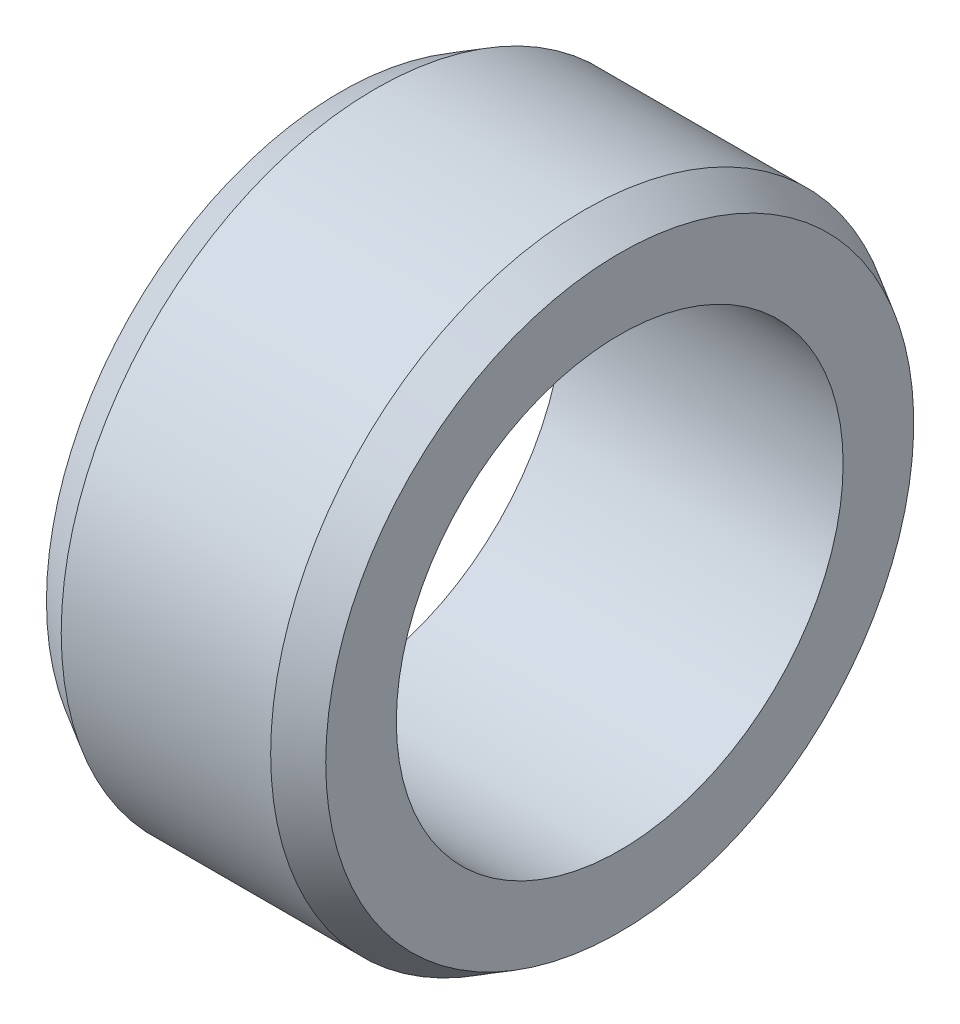
ISO-10303-21;
HEADER;
FILE_DESCRIPTION(('STEP AP214'),'2;1');
FILE_NAME('part.step','',(''),(''),'','','');
FILE_SCHEMA(('AUTOMOTIVE_DESIGN { 1 0 10303 214 1 1 1 1 }'));
ENDSEC;
DATA;
#1=APPLICATION_CONTEXT('core data for automotive mechanical design processes');
#2=APPLICATION_PROTOCOL_DEFINITION('international standard','automotive_design',2000,#1);
#3=PRODUCT_CONTEXT('',#1,'mechanical');
#4=PRODUCT('Part','Part','',(#3));
#5=PRODUCT_RELATED_PRODUCT_CATEGORY('part','',(#4));
#6=PRODUCT_DEFINITION_FORMATION('','',#4);
#7=PRODUCT_DEFINITION_CONTEXT('part definition',#1,'design');
#8=PRODUCT_DEFINITION('design','',#6,#7);
#9=PRODUCT_DEFINITION_SHAPE('','',#8);
#10=(LENGTH_UNIT() NAMED_UNIT(*) SI_UNIT(.MILLI.,.METRE.));
#11=(NAMED_UNIT(*) PLANE_ANGLE_UNIT() SI_UNIT($,.RADIAN.));
#12=(NAMED_UNIT(*) SI_UNIT($,.STERADIAN.) SOLID_ANGLE_UNIT());
#13=UNCERTAINTY_MEASURE_WITH_UNIT(LENGTH_MEASURE(1.E-05),#10,'distance_accuracy_value','');
#14=(GEOMETRIC_REPRESENTATION_CONTEXT(3) GLOBAL_UNCERTAINTY_ASSIGNED_CONTEXT((#13)) GLOBAL_UNIT_ASSIGNED_CONTEXT((#10,
#11,#12)) REPRESENTATION_CONTEXT('',''));
#15=CARTESIAN_POINT('',(0.,0.,0.));
#16=DIRECTION('',(0.,0.,1.));
#17=DIRECTION('',(1.,0.,0.));
#18=AXIS2_PLACEMENT_3D('',#15,#16,#17);
#19=CARTESIAN_POINT('',(0.,-4.21132486540523,-4.21132486540521));
#20=DIRECTION('',(-1.,0.,0.));
#21=DIRECTION('',(0.,0.,1.));
#22=AXIS2_PLACEMENT_3D('',#19,#20,#21);
#23=PLANE('',#22);
#24=CARTESIAN_POINT('',(0.,0.,0.));
#25=DIRECTION('',(-1.,0.,0.));
#26=DIRECTION('',(0.,0.,-1.));
#27=AXIS2_PLACEMENT_3D('',#24,#25,#26);
#28=CIRCLE('',#27,4.2113248654052);
#29=CARTESIAN_POINT('',(0.,0.,-4.2113248654052));
#30=VERTEX_POINT('',#29);
#31=EDGE_CURVE('E38',#30,#30,#28,.F.);
#32=ORIENTED_EDGE('',*,*,#31,.F.);
#33=EDGE_LOOP('',(#32));
#34=FACE_BOUND('',#33,.T.);
#35=CARTESIAN_POINT('',(0.,0.,0.));
#36=DIRECTION('',(1.,0.,0.));
#37=DIRECTION('',(0.,-1.42053886986739E-07,0.99999999999999));
#38=AXIS2_PLACEMENT_3D('',#35,#36,#37);
#39=CIRCLE('',#38,3.2);
#40=CARTESIAN_POINT('',(0.,-4.54572438357566E-07,3.19999999999997));
#41=VERTEX_POINT('',#40);
#42=EDGE_CURVE('E35',#41,#41,#39,.T.);
#43=ORIENTED_EDGE('',*,*,#42,.T.);
#44=EDGE_LOOP('',(#43));
#45=FACE_BOUND('',#44,.T.);
#46=ADVANCED_FACE('F15',(#34,#45),#23,.T.);
#47=CARTESIAN_POINT('',(4.,-4.21132466155257,4.21132518839896));
#48=DIRECTION('',(1.,0.,0.));
#49=DIRECTION('',(0.,0.,-1.));
#50=AXIS2_PLACEMENT_3D('',#47,#48,#49);
#51=PLANE('',#50);
#52=CARTESIAN_POINT('',(4.,0.,0.));
#53=DIRECTION('',(1.,0.,0.));
#54=DIRECTION('',(0.,-1.41914846086789E-07,0.99999999999999));
#55=AXIS2_PLACEMENT_3D('',#52,#53,#54);
#56=CIRCLE('',#55,4.2113248654052);
#57=CARTESIAN_POINT('',(4.,-5.97649520095448E-07,4.21132486540516));
#58=VERTEX_POINT('',#57);
#59=EDGE_CURVE('E30',#58,#58,#56,.T.);
#60=ORIENTED_EDGE('',*,*,#59,.T.);
#61=EDGE_LOOP('',(#60));
#62=FACE_BOUND('',#61,.T.);
#63=CARTESIAN_POINT('',(4.,0.,0.));
#64=DIRECTION('',(-1.,0.,0.));
#65=DIRECTION('',(0.,0.,-1.));
#66=AXIS2_PLACEMENT_3D('',#63,#64,#65);
#67=CIRCLE('',#66,3.2);
#68=CARTESIAN_POINT('',(4.,0.,-3.2));
#69=VERTEX_POINT('',#68);
#70=EDGE_CURVE('E26',#69,#69,#67,.F.);
#71=ORIENTED_EDGE('',*,*,#70,.F.);
#72=EDGE_LOOP('',(#71));
#73=FACE_BOUND('',#72,.T.);
#74=ADVANCED_FACE('F46',(#62,#73),#51,.T.);
#75=CARTESIAN_POINT('',(4.,0.,0.));
#76=DIRECTION('',(1.,0.,0.));
#77=DIRECTION('',(0.,0.,1.));
#78=AXIS2_PLACEMENT_3D('',#75,#76,#77);
#79=CYLINDRICAL_SURFACE('',#78,3.2);
#80=ORIENTED_EDGE('',*,*,#70,.T.);
#81=EDGE_LOOP('',(#80));
#82=FACE_BOUND('',#81,.T.);
#83=ORIENTED_EDGE('',*,*,#42,.F.);
#84=EDGE_LOOP('',(#83));
#85=FACE_BOUND('',#84,.T.);
#86=ADVANCED_FACE('F50',(#82,#85),#79,.F.);
#87=CARTESIAN_POINT('',(3.5,0.,0.));
#88=DIRECTION('',(-1.,0.,0.));
#89=DIRECTION('',(0.,0.,-1.));
#90=AXIS2_PLACEMENT_3D('',#87,#88,#89);
#91=CONICAL_SURFACE('',#90,4.5,0.52359877559828);
#92=ORIENTED_EDGE('',*,*,#59,.F.);
#93=EDGE_LOOP('',(#92));
#94=FACE_BOUND('',#93,.T.);
#95=CARTESIAN_POINT('',(3.5,0.,0.));
#96=DIRECTION('',(1.,0.,0.));
#97=DIRECTION('',(0.,0.,1.));
#98=AXIS2_PLACEMENT_3D('',#95,#96,#97);
#99=CIRCLE('',#98,4.5);
#100=CARTESIAN_POINT('',(3.5,0.,4.5));
#101=VERTEX_POINT('',#100);
#102=EDGE_CURVE('E22',#101,#101,#99,.T.);
#103=ORIENTED_EDGE('',*,*,#102,.T.);
#104=EDGE_LOOP('',(#103));
#105=FACE_BOUND('',#104,.T.);
#106=ADVANCED_FACE('F52',(#94,#105),#91,.T.);
#107=CARTESIAN_POINT('',(4.,0.,0.));
#108=DIRECTION('',(1.,0.,0.));
#109=DIRECTION('',(0.,0.,1.));
#110=AXIS2_PLACEMENT_3D('',#107,#108,#109);
#111=CYLINDRICAL_SURFACE('',#110,4.5);
#112=CARTESIAN_POINT('',(0.5,0.,0.));
#113=DIRECTION('',(1.,0.,0.));
#114=DIRECTION('',(0.,0.,1.));
#115=AXIS2_PLACEMENT_3D('',#112,#113,#114);
#116=CIRCLE('',#115,4.5);
#117=CARTESIAN_POINT('',(0.5,0.,4.5));
#118=VERTEX_POINT('',#117);
#119=EDGE_CURVE('E10',#118,#118,#116,.T.);
#120=ORIENTED_EDGE('',*,*,#119,.T.);
#121=EDGE_LOOP('',(#120));
#122=FACE_BOUND('',#121,.T.);
#123=ORIENTED_EDGE('',*,*,#102,.F.);
#124=EDGE_LOOP('',(#123));
#125=FACE_BOUND('',#124,.T.);
#126=ADVANCED_FACE('F60',(#122,#125),#111,.T.);
#127=CARTESIAN_POINT('',(0.500000000000001,0.,0.));
#128=DIRECTION('',(1.,0.,0.));
#129=DIRECTION('',(0.,1.4172188324036E-07,0.99999999999999));
#130=AXIS2_PLACEMENT_3D('',#127,#128,#129);
#131=CONICAL_SURFACE('',#130,4.5,0.523598775598279);
#132=ORIENTED_EDGE('',*,*,#31,.T.);
#133=EDGE_LOOP('',(#132));
#134=FACE_BOUND('',#133,.T.);
#135=ORIENTED_EDGE('',*,*,#119,.F.);
#136=EDGE_LOOP('',(#135));
#137=FACE_BOUND('',#136,.T.);
#138=ADVANCED_FACE('F17',(#134,#137),#131,.T.);
#139=CLOSED_SHELL('',(#46,#74,#86,#106,#126,#138));
#140=MANIFOLD_SOLID_BREP('B1',#139);
#141=ADVANCED_BREP_SHAPE_REPRESENTATION('',(#18,#140),#14);
#142=SHAPE_DEFINITION_REPRESENTATION(#9,#141);
ENDSEC;
END-ISO-10303-21;
